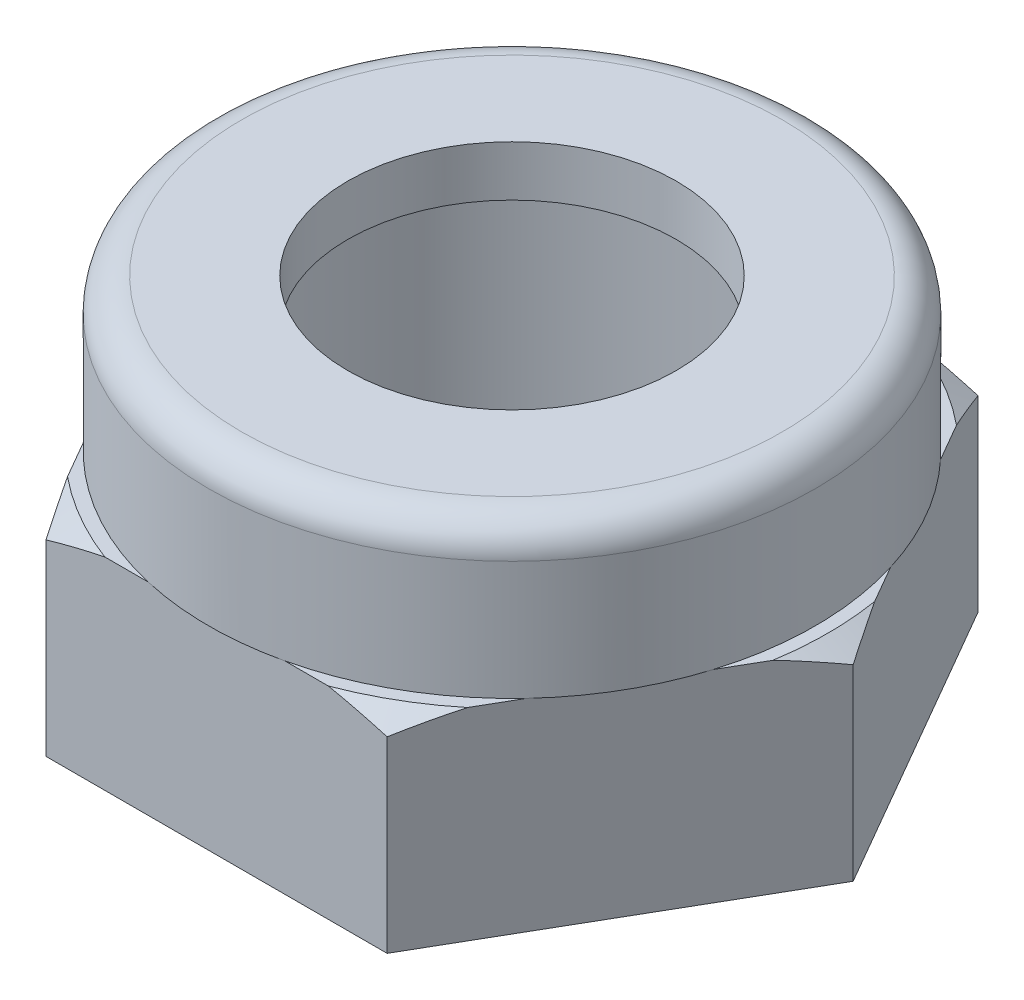
ISO-10303-21;
HEADER;
FILE_DESCRIPTION(('STEP AP214'),'2;1');
FILE_NAME('part.step','',(''),(''),'','','');
FILE_SCHEMA(('AUTOMOTIVE_DESIGN { 1 0 10303 214 1 1 1 1 }'));
ENDSEC;
DATA;
#1=APPLICATION_CONTEXT('core data for automotive mechanical design processes');
#2=APPLICATION_PROTOCOL_DEFINITION('international standard','automotive_design',2000,#1);
#3=PRODUCT_CONTEXT('',#1,'mechanical');
#4=PRODUCT('Part','Part','',(#3));
#5=PRODUCT_RELATED_PRODUCT_CATEGORY('part','',(#4));
#6=PRODUCT_DEFINITION_FORMATION('','',#4);
#7=PRODUCT_DEFINITION_CONTEXT('part definition',#1,'design');
#8=PRODUCT_DEFINITION('design','',#6,#7);
#9=PRODUCT_DEFINITION_SHAPE('','',#8);
#10=(LENGTH_UNIT() NAMED_UNIT(*) SI_UNIT(.MILLI.,.METRE.));
#11=(NAMED_UNIT(*) PLANE_ANGLE_UNIT() SI_UNIT($,.RADIAN.));
#12=(NAMED_UNIT(*) SI_UNIT($,.STERADIAN.) SOLID_ANGLE_UNIT());
#13=UNCERTAINTY_MEASURE_WITH_UNIT(LENGTH_MEASURE(1.E-05),#10,'distance_accuracy_value','');
#14=(GEOMETRIC_REPRESENTATION_CONTEXT(3) GLOBAL_UNCERTAINTY_ASSIGNED_CONTEXT((#13)) GLOBAL_UNIT_ASSIGNED_CONTEXT((#10,
#11,#12)) REPRESENTATION_CONTEXT('',''));
#15=CARTESIAN_POINT('',(0.,0.,0.));
#16=DIRECTION('',(0.,0.,1.));
#17=DIRECTION('',(1.,0.,0.));
#18=AXIS2_PLACEMENT_3D('',#15,#16,#17);
#19=CARTESIAN_POINT('',(0.,0.,-13.5));
#20=DIRECTION('',(0.,-1.,0.));
#21=DIRECTION('',(0.,0.,-1.));
#22=AXIS2_PLACEMENT_3D('',#19,#20,#21);
#23=PLANE('',#22);
#24=CARTESIAN_POINT('',(0.,0.,0.));
#25=DIRECTION('',(0.,-1.,0.));
#26=DIRECTION('',(0.,0.,-1.));
#27=AXIS2_PLACEMENT_3D('',#24,#25,#26);
#28=CIRCLE('',#27,11.6);
#29=CARTESIAN_POINT('',(0.,0.,-11.6));
#30=VERTEX_POINT('',#29);
#31=EDGE_CURVE('E12',#30,#30,#28,.F.);
#32=ORIENTED_EDGE('',*,*,#31,.T.);
#33=EDGE_LOOP('',(#32));
#34=FACE_BOUND('',#33,.T.);
#35=DIRECTION('',(-1.,0.,0.));
#36=VECTOR('',#35,1.);
#37=CARTESIAN_POINT('',(6.74999999999989,0.,11.69134295109));
#38=LINE('',#37,#36);
#39=CARTESIAN_POINT('',(6.74999999999989,0.,11.69134295109));
#40=VERTEX_POINT('',#39);
#41=CARTESIAN_POINT('',(-6.75000000000013,0.,11.6913429510898));
#42=VERTEX_POINT('',#41);
#43=EDGE_CURVE('E204',#40,#42,#38,.T.);
#44=ORIENTED_EDGE('',*,*,#43,.T.);
#45=DIRECTION('',(-0.499999999999995,0.,-0.866025403784441));
#46=VECTOR('',#45,1.);
#47=CARTESIAN_POINT('',(-6.75000000000013,0.,11.6913429510898));
#48=LINE('',#47,#46);
#49=CARTESIAN_POINT('',(-13.5,0.,0.));
#50=VERTEX_POINT('',#49);
#51=EDGE_CURVE('E198',#42,#50,#48,.T.);
#52=ORIENTED_EDGE('',*,*,#51,.T.);
#53=DIRECTION('',(0.500000000000001,0.,-0.866025403784438));
#54=VECTOR('',#53,1.);
#55=CARTESIAN_POINT('',(-13.5,0.,0.));
#56=LINE('',#55,#54);
#57=CARTESIAN_POINT('',(-6.74999999999998,0.,-11.6913429510899));
#58=VERTEX_POINT('',#57);
#59=EDGE_CURVE('E194',#50,#58,#56,.T.);
#60=ORIENTED_EDGE('',*,*,#59,.T.);
#61=DIRECTION('',(1.,0.,0.));
#62=VECTOR('',#61,1.);
#63=CARTESIAN_POINT('',(-6.74999999999997,0.,-11.6913429510899));
#64=LINE('',#63,#62);
#65=CARTESIAN_POINT('',(6.75000000000005,0.,-11.6913429510899));
#66=VERTEX_POINT('',#65);
#67=EDGE_CURVE('E61',#58,#66,#64,.T.);
#68=ORIENTED_EDGE('',*,*,#67,.T.);
#69=DIRECTION('',(0.499999999999995,0.,0.866025403784442));
#70=VECTOR('',#69,1.);
#71=CARTESIAN_POINT('',(6.75000000000005,0.,-11.6913429510899));
#72=LINE('',#71,#70);
#73=CARTESIAN_POINT('',(13.5,0.,0.));
#74=VERTEX_POINT('',#73);
#75=EDGE_CURVE('E182',#66,#74,#72,.T.);
#76=ORIENTED_EDGE('',*,*,#75,.T.);
#77=DIRECTION('',(-0.500000000000007,0.,0.866025403784435));
#78=VECTOR('',#77,1.);
#79=CARTESIAN_POINT('',(13.5,0.,0.));
#80=LINE('',#79,#78);
#81=EDGE_CURVE('E189',#74,#40,#80,.T.);
#82=ORIENTED_EDGE('',*,*,#81,.T.);
#83=EDGE_LOOP('',(#44,#52,#60,#68,#76,#82));
#84=FACE_BOUND('',#83,.T.);
#85=ADVANCED_FACE('F44',(#34,#84),#23,.T.);
#86=CARTESIAN_POINT('',(0.,8.,-12.));
#87=DIRECTION('',(0.,1.,0.));
#88=DIRECTION('',(0.,0.,1.));
#89=AXIS2_PLACEMENT_3D('',#86,#87,#88);
#90=PLANE('',#89);
#91=CARTESIAN_POINT('',(0.,8.,0.));
#92=DIRECTION('',(0.,1.,0.));
#93=DIRECTION('',(0.,0.,1.));
#94=AXIS2_PLACEMENT_3D('',#91,#92,#93);
#95=CIRCLE('',#94,12.5);
#96=CARTESIAN_POINT('',(-12.3364757516192,8.,-2.01528311403384));
#97=VERTEX_POINT('',#96);
#98=CARTESIAN_POINT('',(-12.3364757516192,8.,2.01528311403388));
#99=VERTEX_POINT('',#98);
#100=EDGE_CURVE('E451',#97,#99,#95,.T.);
#101=ORIENTED_EDGE('',*,*,#100,.T.);
#102=DIRECTION('',(-0.499999999999995,0.,-0.866025403784441));
#103=VECTOR('',#102,1.);
#104=CARTESIAN_POINT('',(-6.75000000000013,8.,11.6913429510898));
#105=LINE('',#104,#103);
#106=CARTESIAN_POINT('',(-11.477081728299,8.,3.50379722614566));
#107=VERTEX_POINT('',#106);
#108=EDGE_CURVE('E207',#107,#99,#105,.T.);
#109=ORIENTED_EDGE('',*,*,#108,.F.);
#110=CARTESIAN_POINT('',(0.,8.,0.));
#111=DIRECTION('',(0.,-1.,0.));
#112=DIRECTION('',(0.,0.,-1.));
#113=AXIS2_PLACEMENT_3D('',#110,#111,#112);
#114=CIRCLE('',#113,12.);
#115=CARTESIAN_POINT('',(-11.477081728299,8.,-3.50379722614555));
#116=VERTEX_POINT('',#115);
#117=EDGE_CURVE('E427',#107,#116,#114,.T.);
#118=ORIENTED_EDGE('',*,*,#117,.T.);
#119=DIRECTION('',(0.500000000000001,0.,-0.866025403784438));
#120=VECTOR('',#119,1.);
#121=CARTESIAN_POINT('',(-13.5,8.,0.));
#122=LINE('',#121,#120);
#123=EDGE_CURVE('E357',#97,#116,#122,.T.);
#124=ORIENTED_EDGE('',*,*,#123,.F.);
#125=EDGE_LOOP('',(#101,#109,#118,#124));
#126=FACE_BOUND('',#125,.T.);
#127=ADVANCED_FACE('F298',(#126),#90,.T.);
#128=CARTESIAN_POINT('',(-2.70416345659816,8.,11.6913429510899));
#129=VERTEX_POINT('',#128);
#130=CARTESIAN_POINT('',(-8.77291827170116,8.,8.18754572494419));
#131=VERTEX_POINT('',#130);
#132=EDGE_CURVE('E417',#129,#131,#114,.T.);
#133=ORIENTED_EDGE('',*,*,#132,.T.);
#134=CARTESIAN_POINT('',(-7.91352424838089,8.,9.67605983705596));
#135=VERTEX_POINT('',#134);
#136=EDGE_CURVE('E446',#135,#131,#105,.T.);
#137=ORIENTED_EDGE('',*,*,#136,.F.);
#138=CARTESIAN_POINT('',(-4.42295150323865,8.,11.6913429510899));
#139=VERTEX_POINT('',#138);
#140=EDGE_CURVE('E253',#135,#139,#95,.T.);
#141=ORIENTED_EDGE('',*,*,#140,.T.);
#142=DIRECTION('',(-1.,0.,0.));
#143=VECTOR('',#142,1.);
#144=CARTESIAN_POINT('',(6.74999999999989,8.,11.69134295109));
#145=LINE('',#144,#143);
#146=EDGE_CURVE('E391',#129,#139,#145,.T.);
#147=ORIENTED_EDGE('',*,*,#146,.F.);
#148=EDGE_LOOP('',(#133,#137,#141,#147));
#149=FACE_BOUND('',#148,.T.);
#150=ADVANCED_FACE('F301',(#149),#90,.T.);
#151=CARTESIAN_POINT('',(8.7729182717009,8.,8.18754572494447));
#152=VERTEX_POINT('',#151);
#153=CARTESIAN_POINT('',(2.70416345659791,8.,11.6913429510899));
#154=VERTEX_POINT('',#153);
#155=EDGE_CURVE('E414',#152,#154,#114,.T.);
#156=ORIENTED_EDGE('',*,*,#155,.T.);
#157=CARTESIAN_POINT('',(4.4229515032384,8.,11.69134295109));
#158=VERTEX_POINT('',#157);
#159=EDGE_CURVE('E221',#158,#154,#145,.T.);
#160=ORIENTED_EDGE('',*,*,#159,.F.);
#161=CARTESIAN_POINT('',(7.91352424838065,8.,9.67605983705615));
#162=VERTEX_POINT('',#161);
#163=EDGE_CURVE('E254',#158,#162,#95,.T.);
#164=ORIENTED_EDGE('',*,*,#163,.T.);
#165=DIRECTION('',(-0.500000000000007,0.,0.866025403784435));
#166=VECTOR('',#165,1.);
#167=CARTESIAN_POINT('',(13.5,8.,0.));
#168=LINE('',#167,#166);
#169=EDGE_CURVE('E379',#152,#162,#168,.T.);
#170=ORIENTED_EDGE('',*,*,#169,.F.);
#171=EDGE_LOOP('',(#156,#160,#164,#170));
#172=FACE_BOUND('',#171,.T.);
#173=ADVANCED_FACE('F422',(#172),#90,.T.);
#174=CARTESIAN_POINT('',(11.477081728299,8.,-3.50379722614545));
#175=VERTEX_POINT('',#174);
#176=CARTESIAN_POINT('',(11.477081728299,8.,3.50379722614561));
#177=VERTEX_POINT('',#176);
#178=EDGE_CURVE('E232',#175,#177,#114,.T.);
#179=ORIENTED_EDGE('',*,*,#178,.T.);
#180=CARTESIAN_POINT('',(12.3364757516192,8.,2.01528311403392));
#181=VERTEX_POINT('',#180);
#182=EDGE_CURVE('E382',#181,#177,#168,.T.);
#183=ORIENTED_EDGE('',*,*,#182,.F.);
#184=CARTESIAN_POINT('',(12.3364757516193,8.,-2.01528311403375));
#185=VERTEX_POINT('',#184);
#186=EDGE_CURVE('E259',#181,#185,#95,.T.);
#187=ORIENTED_EDGE('',*,*,#186,.T.);
#188=DIRECTION('',(0.499999999999995,0.,0.866025403784442));
#189=VECTOR('',#188,1.);
#190=CARTESIAN_POINT('',(6.75000000000005,8.,-11.6913429510899));
#191=LINE('',#190,#189);
#192=EDGE_CURVE('E369',#175,#185,#191,.T.);
#193=ORIENTED_EDGE('',*,*,#192,.F.);
#194=EDGE_LOOP('',(#179,#183,#187,#193));
#195=FACE_BOUND('',#194,.T.);
#196=ADVANCED_FACE('F530',(#195),#90,.T.);
#197=CARTESIAN_POINT('',(2.70416345659807,8.,-11.6913429510899));
#198=VERTEX_POINT('',#197);
#199=CARTESIAN_POINT('',(8.77291827170102,8.,-8.18754572494434));
#200=VERTEX_POINT('',#199);
#201=EDGE_CURVE('E227',#198,#200,#114,.T.);
#202=ORIENTED_EDGE('',*,*,#201,.T.);
#203=CARTESIAN_POINT('',(7.91352424838078,8.,-9.67605983705604));
#204=VERTEX_POINT('',#203);
#205=EDGE_CURVE('E350',#204,#200,#191,.T.);
#206=ORIENTED_EDGE('',*,*,#205,.F.);
#207=CARTESIAN_POINT('',(4.42295150323856,8.,-11.6913429510899));
#208=VERTEX_POINT('',#207);
#209=EDGE_CURVE('E353',#204,#208,#95,.T.);
#210=ORIENTED_EDGE('',*,*,#209,.T.);
#211=DIRECTION('',(1.,0.,0.));
#212=VECTOR('',#211,1.);
#213=CARTESIAN_POINT('',(-6.74999999999997,8.,-11.6913429510899));
#214=LINE('',#213,#212);
#215=EDGE_CURVE('E352',#198,#208,#214,.T.);
#216=ORIENTED_EDGE('',*,*,#215,.F.);
#217=EDGE_LOOP('',(#202,#206,#210,#216));
#218=FACE_BOUND('',#217,.T.);
#219=ADVANCED_FACE('F347',(#218),#90,.T.);
#220=CARTESIAN_POINT('',(-8.77291827170097,8.,-8.18754572494439));
#221=VERTEX_POINT('',#220);
#222=CARTESIAN_POINT('',(-2.704163456598,8.,-11.6913429510899));
#223=VERTEX_POINT('',#222);
#224=EDGE_CURVE('E233',#221,#223,#114,.T.);
#225=ORIENTED_EDGE('',*,*,#224,.T.);
#226=CARTESIAN_POINT('',(-4.42295150323848,8.,-11.6913429510899));
#227=VERTEX_POINT('',#226);
#228=EDGE_CURVE('E359',#227,#223,#214,.T.);
#229=ORIENTED_EDGE('',*,*,#228,.F.);
#230=CARTESIAN_POINT('',(-7.91352424838072,8.,-9.6760598370561));
#231=VERTEX_POINT('',#230);
#232=EDGE_CURVE('E460',#227,#231,#95,.T.);
#233=ORIENTED_EDGE('',*,*,#232,.T.);
#234=EDGE_CURVE('E365',#221,#231,#122,.T.);
#235=ORIENTED_EDGE('',*,*,#234,.F.);
#236=EDGE_LOOP('',(#225,#229,#233,#235));
#237=FACE_BOUND('',#236,.T.);
#238=ADVANCED_FACE('F303',(#237),#90,.T.);
#239=CARTESIAN_POINT('',(0.,7.42264973081037,0.));
#240=DIRECTION('',(0.,-1.,0.));
#241=DIRECTION('',(0.,0.,-1.));
#242=AXIS2_PLACEMENT_3D('',#239,#240,#241);
#243=CONICAL_SURFACE('',#242,13.5,1.0471975511966);
#244=ORIENTED_EDGE('',*,*,#140,.F.);
#245=CARTESIAN_POINT('',(-13.5004041451884,7.42241638699952,-0.0007));
#246=CARTESIAN_POINT('',(-13.3520221794924,7.50807589105226,0.256305103512444));
#247=CARTESIAN_POINT('',(-13.2030869667463,7.58984802603486,0.514268459024735));
#248=CARTESIAN_POINT('',(-12.9040221630351,7.74453885758792,1.03226389380826));
#249=CARTESIAN_POINT('',(-12.7538921964382,7.81745464225572,1.29229662369274));
#250=CARTESIAN_POINT('',(-12.3010830182735,8.02150655548143,2.07658512640738));
#251=CARTESIAN_POINT('',(-11.996616201088,8.13757287342653,2.6039371229915));
#252=CARTESIAN_POINT('',(-11.5409955163696,8.27367603116612,3.39309529790317));
#253=CARTESIAN_POINT('',(-11.3912030140215,8.31244761215666,3.652543522563));
#254=CARTESIAN_POINT('',(-11.0909243203889,8.37746722686058,4.17264147636505));
#255=CARTESIAN_POINT('',(-10.9404381158136,8.40371501961168,4.43329122852768));
#256=CARTESIAN_POINT('',(-10.6392146913374,8.44301473352314,4.9550255041503));
#257=CARTESIAN_POINT('',(-10.4884779840743,8.45608233840359,5.21610913969564));
#258=CARTESIAN_POINT('',(-10.1868647374805,8.46874320092821,5.73851860703194));
#259=CARTESIAN_POINT('',(-10.0359882026117,8.4683368746631,5.99984443109464));
#260=CARTESIAN_POINT('',(-9.75390524547986,8.4549882673845,6.48842644479622));
#261=CARTESIAN_POINT('',(-9.62267874384666,8.44367422607495,6.71571741292446));
#262=CARTESIAN_POINT('',(-9.36052753349487,8.41106602795221,7.16977662851943));
#263=CARTESIAN_POINT('',(-9.22960284679319,8.38977116484764,7.39654483785179));
#264=CARTESIAN_POINT('',(-8.96812643014912,8.33757270541938,7.84943527646037));
#265=CARTESIAN_POINT('',(-8.83757509871046,8.30666116870838,8.07555681550789));
#266=CARTESIAN_POINT('',(-8.57708457978593,8.23577190260181,8.52673962917517));
#267=CARTESIAN_POINT('',(-8.44714543453592,8.19579355675579,8.75180083064027));
#268=CARTESIAN_POINT('',(-8.05270676947056,8.06124753513704,9.43498863900312));
#269=CARTESIAN_POINT('',(-7.78934970799097,7.9532620438052,9.89113645001782));
#270=CARTESIAN_POINT('',(-7.26656345425055,7.70817650317858,10.7966288029948));
#271=CARTESIAN_POINT('',(-7.00712756413563,7.57113404492589,11.2459849459807));
#272=CARTESIAN_POINT('',(-6.7495958548117,7.42241638699952,11.6920429510898));
#273=B_SPLINE_CURVE_WITH_KNOTS('',3,(#245,#246,#247,#248,#249,#250,#251,#252,#253,#254,#255,
#256,#257,#258,#259,#260,#261,#262,#263,#264,#265,#266,#267,#268,#269,#270,#271,#272),
.UNSPECIFIED.,.F.,.F.,(4,2,2,2,2,2,2,2,2,2,2,2,2,4),(0.,0.926563632411528,1.85343109213171,
3.71111260515696,4.61715212150051,5.52320906967365,6.42818658190973,7.33313614740977,
8.12103653288097,8.90899268242645,9.69760117370425,10.486263298389,12.0982779379972,
13.7071269345817),.UNSPECIFIED.);
#274=CARTESIAN_POINT('',(-6.75000000000013,7.42264973081037,11.6913429510898));
#275=VERTEX_POINT('',#274);
#276=EDGE_CURVE('E471',#135,#275,#273,.T.);
#277=ORIENTED_EDGE('',*,*,#276,.T.);
#278=CARTESIAN_POINT('',(-6.75070000000013,7.42244765035798,11.6913429510898));
#279=CARTESIAN_POINT('',(-6.45393698052101,7.50810586096598,11.6913429510898));
#280=CARTESIAN_POINT('',(-6.15606747141357,7.58987667122378,11.6913429510898));
#281=CARTESIAN_POINT('',(-5.55793971559512,7.74456479596085,11.6913429510899));
#282=CARTESIAN_POINT('',(-5.25768071762788,7.81747919852352,11.6913429510899));
#283=CARTESIAN_POINT('',(-4.35206527410896,8.02152686878093,11.6913429510899));
#284=CARTESIAN_POINT('',(-3.74313366026425,8.13759025266538,11.6913429510899));
#285=CARTESIAN_POINT('',(-2.83189533463,8.27368903846372,11.6913429510899));
#286=CARTESIAN_POINT('',(-2.53231127204581,8.31245918954676,11.6913429510899));
#287=CARTESIAN_POINT('',(-1.93175582523191,8.37747595796385,11.6913429510899));
#288=CARTESIAN_POINT('',(-1.63078441441983,8.40372233431978,11.6913429510899));
#289=CARTESIAN_POINT('',(-1.02833961089227,8.44301926551599,11.6913429510899));
#290=CARTESIAN_POINT('',(-0.726867243345393,8.45608550350752,11.6913429510899));
#291=CARTESIAN_POINT('',(-0.123642905026414,8.46874371500357,11.6913429510899));
#292=CARTESIAN_POINT('',(0.178109056822752,8.46833610464009,11.6913429510899));
#293=CARTESIAN_POINT('',(0.742265820336324,8.4549853707747,11.6913429510899));
#294=CARTESIAN_POINT('',(1.00471079416508,8.44367074585779,11.6913429510899));
#295=CARTESIAN_POINT('',(1.5289971644472,8.41106201282665,11.6913429510899));
#296=CARTESIAN_POINT('',(1.79083851687153,8.38976719852997,11.6913429510899));
#297=CARTESIAN_POINT('',(2.31377532562189,8.33756944503508,11.6913429510899));
#298=CARTESIAN_POINT('',(2.57486998505327,8.306658566707,11.6913429510899));
#299=CARTESIAN_POINT('',(3.09583508665537,8.23577118052246,11.6913429510899));
#300=CARTESIAN_POINT('',(3.35570544436492,8.19579405629512,11.6913429510899));
#301=CARTESIAN_POINT('',(4.14455828646923,8.06125260425644,11.69134295109));
#302=CARTESIAN_POINT('',(4.67125600464197,7.95327129585099,11.69134295109));
#303=CARTESIAN_POINT('',(5.71679625919071,7.70819571065819,11.69134295109));
#304=CARTESIAN_POINT('',(6.2356521893125,7.57115901701527,11.69134295109));
#305=CARTESIAN_POINT('',(6.75069999999989,7.42244765035798,11.69134295109));
#306=B_SPLINE_CURVE_WITH_KNOTS('',3,(#278,#279,#280,#281,#282,#283,#284,#285,#286,#287,#288,
#289,#290,#291,#292,#293,#294,#295,#296,#297,#298,#299,#300,#301,#302,#303,#304,#305),
.UNSPECIFIED.,.F.,.F.,(4,2,2,2,2,2,2,2,2,2,2,2,2,4),(0.,0.92655992728907,1.85342368018105,
3.71109757512918,4.61713373776867,5.52318733333754,6.42816153223016,7.33310778154525,
8.12098419570767,8.90891636718086,9.69750079848619,10.4861388579711,12.0981028490782,
13.7069015563939),.UNSPECIFIED.);
#307=EDGE_CURVE('E472',#275,#139,#306,.T.);
#308=ORIENTED_EDGE('',*,*,#307,.T.);
#309=EDGE_LOOP('',(#244,#277,#308));
#310=FACE_BOUND('',#309,.T.);
#311=ADVANCED_FACE('F277',(#310),#243,.T.);
#312=ORIENTED_EDGE('',*,*,#163,.F.);
#313=CARTESIAN_POINT('',(6.74999999999989,7.42264973081037,11.69134295109));
#314=VERTEX_POINT('',#313);
#315=EDGE_CURVE('E407',#158,#314,#306,.T.);
#316=ORIENTED_EDGE('',*,*,#315,.T.);
#317=CARTESIAN_POINT('',(6.74959585481146,7.42241638699952,11.69204295109));
#318=CARTESIAN_POINT('',(6.89797782050748,7.50807589105226,11.4350378475775));
#319=CARTESIAN_POINT('',(7.04691303325356,7.58984802603486,11.1770744920653));
#320=CARTESIAN_POINT('',(7.34597783696482,7.74453885758792,10.6590790572817));
#321=CARTESIAN_POINT('',(7.49610780356174,7.81745464225572,10.3990463273973));
#322=CARTESIAN_POINT('',(7.94891698172637,8.02150655548144,9.61475782468262));
#323=CARTESIAN_POINT('',(8.25338379891191,8.13757287342655,9.0874058280985));
#324=CARTESIAN_POINT('',(8.70900448363036,8.27367603116613,8.29824765318684));
#325=CARTESIAN_POINT('',(8.85879698597848,8.31244761215668,8.03879942852701));
#326=CARTESIAN_POINT('',(9.15907567961107,8.3774672268606,7.51870147472497));
#327=CARTESIAN_POINT('',(9.30956188418638,8.4037150196117,7.25805172256234));
#328=CARTESIAN_POINT('',(9.61078530866256,8.44301473352316,6.73631744693972));
#329=CARTESIAN_POINT('',(9.76152201592566,8.45608233840361,6.47523381139439));
#330=CARTESIAN_POINT('',(10.0631352625195,8.46874320092823,5.95282434405809));
#331=CARTESIAN_POINT('',(10.2140117973883,8.46833687466312,5.6914985199954));
#332=CARTESIAN_POINT('',(10.4960947545201,8.45498826738453,5.20291650629381));
#333=CARTESIAN_POINT('',(10.6273212561533,8.44367422607498,4.97562553816557));
#334=CARTESIAN_POINT('',(10.8894724665051,8.41106602795224,4.52156632257059));
#335=CARTESIAN_POINT('',(11.0203971532068,8.38977116484767,4.29479811323823));
#336=CARTESIAN_POINT('',(11.2818735698509,8.33757270541941,3.84190767462964));
#337=CARTESIAN_POINT('',(11.4124249012896,8.30666116870841,3.61578613558212));
#338=CARTESIAN_POINT('',(11.6729154202141,8.23577190260184,3.16460332191482));
#339=CARTESIAN_POINT('',(11.8028545654641,8.19579355675582,2.93954212044972));
#340=CARTESIAN_POINT('',(12.1972932305295,8.06124753513707,2.25635431208685));
#341=CARTESIAN_POINT('',(12.4606502920091,7.95326204380522,1.80020650107215));
#342=CARTESIAN_POINT('',(12.9834365457496,7.70817650317859,0.894714148095122));
#343=CARTESIAN_POINT('',(13.2428724358645,7.57113404492589,0.445358005109218));
#344=CARTESIAN_POINT('',(13.5004041451884,7.42241638699952,-0.000699999999906266));
#345=B_SPLINE_CURVE_WITH_KNOTS('',3,(#317,#318,#319,#320,#321,#322,#323,#324,#325,#326,#327,
#328,#329,#330,#331,#332,#333,#334,#335,#336,#337,#338,#339,#340,#341,#342,#343,#344),
.UNSPECIFIED.,.F.,.F.,(4,2,2,2,2,2,2,2,2,2,2,2,2,4),(0.,0.926563632411527,1.85343109213171,
3.71111260515696,4.61715212150051,5.52320906967365,6.42818658190973,7.33313614740977,
8.12103653288099,8.9089926824265,9.69760117370431,10.4862632983891,12.0982779379973,
13.7071269345819),.UNSPECIFIED.);
#346=EDGE_CURVE('E478',#314,#162,#345,.T.);
#347=ORIENTED_EDGE('',*,*,#346,.T.);
#348=EDGE_LOOP('',(#312,#316,#347));
#349=FACE_BOUND('',#348,.T.);
#350=ADVANCED_FACE('F520',(#349),#243,.T.);
#351=ORIENTED_EDGE('',*,*,#186,.F.);
#352=CARTESIAN_POINT('',(13.5,7.42264973081037,0.));
#353=VERTEX_POINT('',#352);
#354=EDGE_CURVE('E485',#181,#353,#345,.T.);
#355=ORIENTED_EDGE('',*,*,#354,.T.);
#356=CARTESIAN_POINT('',(13.5004041451884,7.42241638699952,0.00070000000009427));
#357=CARTESIAN_POINT('',(13.3520221794924,7.50807589105226,-0.256305103512349));
#358=CARTESIAN_POINT('',(13.2030869667463,7.58984802603486,-0.514268459024639));
#359=CARTESIAN_POINT('',(12.9040221630351,7.74453885758792,-1.03226389380816));
#360=CARTESIAN_POINT('',(12.7538921964382,7.81745464225572,-1.29229662369265));
#361=CARTESIAN_POINT('',(12.3010830182735,8.02150655548144,-2.07658512640729));
#362=CARTESIAN_POINT('',(11.996616201088,8.13757287342655,-2.60393712299141));
#363=CARTESIAN_POINT('',(11.5409955163696,8.27367603116614,-3.39309529790307));
#364=CARTESIAN_POINT('',(11.3912030140215,8.31244761215668,-3.6525435225629));
#365=CARTESIAN_POINT('',(11.0909243203889,8.3774672268606,-4.17264147636495));
#366=CARTESIAN_POINT('',(10.9404381158136,8.4037150196117,-4.43329122852758));
#367=CARTESIAN_POINT('',(10.6392146913374,8.44301473352316,-4.95502550415021));
#368=CARTESIAN_POINT('',(10.4884779840743,8.45608233840361,-5.21610913969554));
#369=CARTESIAN_POINT('',(10.1868647374805,8.46874320092823,-5.73851860703184));
#370=CARTESIAN_POINT('',(10.0359882026117,8.46833687466313,-5.99984443109454));
#371=CARTESIAN_POINT('',(9.75390524547986,8.45498826738453,-6.48842644479613));
#372=CARTESIAN_POINT('',(9.62267874384665,8.44367422607498,-6.71571741292437));
#373=CARTESIAN_POINT('',(9.36052753349486,8.41106602795224,-7.16977662851936));
#374=CARTESIAN_POINT('',(9.22960284679317,8.38977116484767,-7.39654483785172));
#375=CARTESIAN_POINT('',(8.96812643014909,8.33757270541941,-7.84943527646032));
#376=CARTESIAN_POINT('',(8.83757509871044,8.30666116870841,-8.07555681550784));
#377=CARTESIAN_POINT('',(8.57708457978589,8.23577190260184,-8.52673962917514));
#378=CARTESIAN_POINT('',(8.44714543453588,8.19579355675582,-8.75180083064024));
#379=CARTESIAN_POINT('',(8.05270676947051,8.06124753513707,-9.43498863900311));
#380=CARTESIAN_POINT('',(7.78934970799091,7.95326204380522,-9.89113645001782));
#381=CARTESIAN_POINT('',(7.26656345425048,7.70817650317859,-10.7966288029949));
#382=CARTESIAN_POINT('',(7.00712756413556,7.57113404492589,-11.2459849459808));
#383=CARTESIAN_POINT('',(6.74959585481162,7.42241638699952,-11.6920429510899));
#384=B_SPLINE_CURVE_WITH_KNOTS('',3,(#356,#357,#358,#359,#360,#361,#362,#363,#364,#365,#366,
#367,#368,#369,#370,#371,#372,#373,#374,#375,#376,#377,#378,#379,#380,#381,#382,#383),
.UNSPECIFIED.,.F.,.F.,(4,2,2,2,2,2,2,2,2,2,2,2,2,4),(0.,0.926563632411527,1.85343109213171,
3.71111260515696,4.61715212150051,5.52320906967365,6.42818658190973,7.33313614740977,
8.12103653288099,8.9089926824265,9.69760117370431,10.4862632983891,12.0982779379973,
13.7071269345819),.UNSPECIFIED.);
#385=EDGE_CURVE('E505',#353,#185,#384,.T.);
#386=ORIENTED_EDGE('',*,*,#385,.T.);
#387=EDGE_LOOP('',(#351,#355,#386));
#388=FACE_BOUND('',#387,.T.);
#389=ADVANCED_FACE('F528',(#388),#243,.T.);
#390=ORIENTED_EDGE('',*,*,#209,.F.);
#391=CARTESIAN_POINT('',(6.75000000000005,7.42264973081037,-11.6913429510899));
#392=VERTEX_POINT('',#391);
#393=EDGE_CURVE('E499',#204,#392,#384,.T.);
#394=ORIENTED_EDGE('',*,*,#393,.T.);
#395=CARTESIAN_POINT('',(6.75070000000005,7.42244765035798,-11.6913429510899));
#396=CARTESIAN_POINT('',(6.45393698052093,7.50810586096598,-11.6913429510899));
#397=CARTESIAN_POINT('',(6.15606747141349,7.58987667122377,-11.6913429510899));
#398=CARTESIAN_POINT('',(5.55793971559503,7.74456479596085,-11.6913429510899));
#399=CARTESIAN_POINT('',(5.25768071762779,7.81747919852352,-11.6913429510899));
#400=CARTESIAN_POINT('',(4.35206527410888,8.02152686878093,-11.6913429510899));
#401=CARTESIAN_POINT('',(3.74313366026417,8.13759025266538,-11.6913429510899));
#402=CARTESIAN_POINT('',(2.83189533462992,8.27368903846372,-11.6913429510899));
#403=CARTESIAN_POINT('',(2.53231127204573,8.31245918954676,-11.6913429510899));
#404=CARTESIAN_POINT('',(1.93175582523183,8.37747595796385,-11.6913429510899));
#405=CARTESIAN_POINT('',(1.63078441441974,8.40372233431978,-11.6913429510899));
#406=CARTESIAN_POINT('',(1.02833961089219,8.44301926551599,-11.6913429510899));
#407=CARTESIAN_POINT('',(0.726867243345309,8.45608550350752,-11.6913429510899));
#408=CARTESIAN_POINT('',(0.12364290502633,8.46874371500357,-11.6913429510899));
#409=CARTESIAN_POINT('',(-0.178109056822836,8.46833610464009,-11.6913429510899));
#410=CARTESIAN_POINT('',(-0.742265820336409,8.4549853707747,-11.6913429510899));
#411=CARTESIAN_POINT('',(-1.00471079416517,8.44367074585778,-11.6913429510899));
#412=CARTESIAN_POINT('',(-1.52899716444728,8.41106201282664,-11.6913429510899));
#413=CARTESIAN_POINT('',(-1.79083851687161,8.38976719852997,-11.6913429510899));
#414=CARTESIAN_POINT('',(-2.31377532562198,8.33756944503507,-11.6913429510899));
#415=CARTESIAN_POINT('',(-2.57486998505336,8.306658566707,-11.6913429510899));
#416=CARTESIAN_POINT('',(-3.09583508665545,8.23577118052246,-11.6913429510899));
#417=CARTESIAN_POINT('',(-3.35570544436501,8.19579405629512,-11.6913429510899));
#418=CARTESIAN_POINT('',(-4.14455828646931,8.06125260425644,-11.6913429510899));
#419=CARTESIAN_POINT('',(-4.67125600464205,7.95327129585099,-11.6913429510899));
#420=CARTESIAN_POINT('',(-5.71679625919079,7.70819571065819,-11.6913429510899));
#421=CARTESIAN_POINT('',(-6.23565218931258,7.57115901701527,-11.6913429510899));
#422=CARTESIAN_POINT('',(-6.75069999999997,7.42244765035798,-11.6913429510899));
#423=B_SPLINE_CURVE_WITH_KNOTS('',3,(#395,#396,#397,#398,#399,#400,#401,#402,#403,#404,#405,
#406,#407,#408,#409,#410,#411,#412,#413,#414,#415,#416,#417,#418,#419,#420,#421,#422),
.UNSPECIFIED.,.F.,.F.,(4,2,2,2,2,2,2,2,2,2,2,2,2,4),(0.,0.926559927289071,1.85342368018105,
3.71109757512918,4.61713373776867,5.52318733333754,6.42816153223016,7.33310778154525,
8.12098419570767,8.90891636718086,9.69750079848619,10.4861388579711,12.0981028490782,
13.7069015563939),.UNSPECIFIED.);
#424=EDGE_CURVE('E174',#392,#208,#423,.T.);
#425=ORIENTED_EDGE('',*,*,#424,.T.);
#426=EDGE_LOOP('',(#390,#394,#425));
#427=FACE_BOUND('',#426,.T.);
#428=ADVANCED_FACE('F578',(#427),#243,.T.);
#429=ORIENTED_EDGE('',*,*,#232,.F.);
#430=CARTESIAN_POINT('',(-6.74999999999997,7.42264973081037,-11.6913429510899));
#431=VERTEX_POINT('',#430);
#432=EDGE_CURVE('E506',#227,#431,#423,.T.);
#433=ORIENTED_EDGE('',*,*,#432,.T.);
#434=CARTESIAN_POINT('',(-6.74959585481154,7.42241638699952,-11.6920429510899));
#435=CARTESIAN_POINT('',(-6.89797782050756,7.50807589105226,-11.4350378475775));
#436=CARTESIAN_POINT('',(-7.04691303325364,7.58984802603486,-11.1770744920652));
#437=CARTESIAN_POINT('',(-7.3459778369649,7.74453885758792,-10.6590790572817));
#438=CARTESIAN_POINT('',(-7.49610780356182,7.81745464225572,-10.3990463273972));
#439=CARTESIAN_POINT('',(-7.94891698172644,8.02150655548144,-9.61475782468256));
#440=CARTESIAN_POINT('',(-8.25338379891197,8.13757287342655,-9.08740582809845));
#441=CARTESIAN_POINT('',(-8.70900448363042,8.27367603116613,-8.29824765318678));
#442=CARTESIAN_POINT('',(-8.85879698597854,8.31244761215668,-8.03879942852695));
#443=CARTESIAN_POINT('',(-9.15907567961112,8.3774672268606,-7.51870147472491));
#444=CARTESIAN_POINT('',(-9.30956188418643,8.4037150196117,-7.25805172256227));
#445=CARTESIAN_POINT('',(-9.6107853086626,8.44301473352316,-6.73631744693965));
#446=CARTESIAN_POINT('',(-9.76152201592571,8.45608233840361,-6.47523381139432));
#447=CARTESIAN_POINT('',(-10.0631352625195,8.46874320092823,-5.95282434405802));
#448=CARTESIAN_POINT('',(-10.2140117973883,8.46833687466312,-5.69149851999533));
#449=CARTESIAN_POINT('',(-10.4960947545202,8.45498826738453,-5.20291650629374));
#450=CARTESIAN_POINT('',(-10.6273212561534,8.44367422607498,-4.9756255381655));
#451=CARTESIAN_POINT('',(-10.8894724665052,8.41106602795224,-4.52156632257051));
#452=CARTESIAN_POINT('',(-11.0203971532068,8.38977116484767,-4.29479811323815));
#453=CARTESIAN_POINT('',(-11.2818735698509,8.33757270541941,-3.84190767462956));
#454=CARTESIAN_POINT('',(-11.4124249012896,8.30666116870841,-3.61578613558204));
#455=CARTESIAN_POINT('',(-11.6729154202141,8.23577190260184,-3.16460332191474));
#456=CARTESIAN_POINT('',(-11.8028545654641,8.19579355675582,-2.93954212044964));
#457=CARTESIAN_POINT('',(-12.1972932305295,8.06124753513706,-2.25635431208677));
#458=CARTESIAN_POINT('',(-12.4606502920091,7.95326204380522,-1.80020650107206));
#459=CARTESIAN_POINT('',(-12.9834365457496,7.70817650317859,-0.894714148095029));
#460=CARTESIAN_POINT('',(-13.2428724358645,7.5711340449259,-0.445358005109123));
#461=CARTESIAN_POINT('',(-13.5004041451884,7.42241638699952,0.000700000000000197));
#462=B_SPLINE_CURVE_WITH_KNOTS('',3,(#434,#435,#436,#437,#438,#439,#440,#441,#442,#443,#444,
#445,#446,#447,#448,#449,#450,#451,#452,#453,#454,#455,#456,#457,#458,#459,#460,#461),
.UNSPECIFIED.,.F.,.F.,(4,2,2,2,2,2,2,2,2,2,2,2,2,4),(0.,0.926563632411528,1.85343109213171,
3.71111260515696,4.61715212150051,5.52320906967365,6.42818658190973,7.33313614740977,
8.12103653288099,8.9089926824265,9.69760117370431,10.4862632983891,12.0982779379973,
13.7071269345819),.UNSPECIFIED.);
#463=EDGE_CURVE('E269',#431,#231,#462,.T.);
#464=ORIENTED_EDGE('',*,*,#463,.T.);
#465=EDGE_LOOP('',(#429,#433,#464));
#466=FACE_BOUND('',#465,.T.);
#467=ADVANCED_FACE('F570',(#466),#243,.T.);
#468=CARTESIAN_POINT('',(-13.5,7.42264973081037,0.));
#469=VERTEX_POINT('',#468);
#470=EDGE_CURVE('E258',#97,#469,#462,.T.);
#471=ORIENTED_EDGE('',*,*,#470,.T.);
#472=EDGE_CURVE('E268',#469,#99,#273,.T.);
#473=ORIENTED_EDGE('',*,*,#472,.T.);
#474=ORIENTED_EDGE('',*,*,#100,.F.);
#475=EDGE_LOOP('',(#471,#473,#474));
#476=FACE_BOUND('',#475,.T.);
#477=ADVANCED_FACE('F324',(#476),#243,.T.);
#478=CARTESIAN_POINT('',(0.,0.,0.));
#479=DIRECTION('',(0.,-1.,0.));
#480=DIRECTION('',(0.,0.,-1.));
#481=AXIS2_PLACEMENT_3D('',#478,#479,#480);
#482=CYLINDRICAL_SURFACE('',#481,10.);
#483=CARTESIAN_POINT('',(0.,1.6,0.));
#484=DIRECTION('',(0.,-1.,0.));
#485=DIRECTION('',(0.,0.,-1.));
#486=AXIS2_PLACEMENT_3D('',#483,#484,#485);
#487=CIRCLE('',#486,10.);
#488=CARTESIAN_POINT('',(0.,1.6,-10.));
#489=VERTEX_POINT('',#488);
#490=EDGE_CURVE('E54',#489,#489,#487,.T.);
#491=ORIENTED_EDGE('',*,*,#490,.T.);
#492=EDGE_LOOP('',(#491));
#493=FACE_BOUND('',#492,.T.);
#494=CARTESIAN_POINT('',(0.,12.,0.));
#495=DIRECTION('',(0.,-1.,0.));
#496=DIRECTION('',(0.,0.,-1.));
#497=AXIS2_PLACEMENT_3D('',#494,#495,#496);
#498=CIRCLE('',#497,10.);
#499=CARTESIAN_POINT('',(0.,12.,-10.));
#500=VERTEX_POINT('',#499);
#501=EDGE_CURVE('E241',#500,#500,#498,.T.);
#502=ORIENTED_EDGE('',*,*,#501,.F.);
#503=EDGE_LOOP('',(#502));
#504=FACE_BOUND('',#503,.T.);
#505=ADVANCED_FACE('F320',(#493,#504),#482,.F.);
#506=CARTESIAN_POINT('',(0.,12.,-10.));
#507=DIRECTION('',(0.,-1.,0.));
#508=DIRECTION('',(0.,0.,-1.));
#509=AXIS2_PLACEMENT_3D('',#506,#507,#508);
#510=PLANE('',#509);
#511=ORIENTED_EDGE('',*,*,#501,.T.);
#512=EDGE_LOOP('',(#511));
#513=FACE_BOUND('',#512,.T.);
#514=CARTESIAN_POINT('',(0.,12.,0.));
#515=DIRECTION('',(0.,-1.,0.));
#516=DIRECTION('',(0.,0.,-1.));
#517=AXIS2_PLACEMENT_3D('',#514,#515,#516);
#518=CIRCLE('',#517,6.5);
#519=CARTESIAN_POINT('',(0.,12.,-6.5));
#520=VERTEX_POINT('',#519);
#521=EDGE_CURVE('E237',#520,#520,#518,.T.);
#522=ORIENTED_EDGE('',*,*,#521,.F.);
#523=EDGE_LOOP('',(#522));
#524=FACE_BOUND('',#523,.T.);
#525=ADVANCED_FACE('F316',(#513,#524),#510,.T.);
#526=CARTESIAN_POINT('',(0.,0.,0.));
#527=DIRECTION('',(0.,-1.,0.));
#528=DIRECTION('',(0.,0.,-1.));
#529=AXIS2_PLACEMENT_3D('',#526,#527,#528);
#530=CYLINDRICAL_SURFACE('',#529,6.5);
#531=ORIENTED_EDGE('',*,*,#521,.T.);
#532=EDGE_LOOP('',(#531));
#533=FACE_BOUND('',#532,.T.);
#534=CARTESIAN_POINT('',(0.,14.,0.));
#535=DIRECTION('',(0.,-1.,0.));
#536=DIRECTION('',(0.,0.,-1.));
#537=AXIS2_PLACEMENT_3D('',#534,#535,#536);
#538=CIRCLE('',#537,6.5);
#539=CARTESIAN_POINT('',(0.,14.,-6.5));
#540=VERTEX_POINT('',#539);
#541=EDGE_CURVE('E231',#540,#540,#538,.T.);
#542=ORIENTED_EDGE('',*,*,#541,.F.);
#543=EDGE_LOOP('',(#542));
#544=FACE_BOUND('',#543,.T.);
#545=ADVANCED_FACE('F312',(#533,#544),#530,.F.);
#546=CARTESIAN_POINT('',(0.,14.,-6.5));
#547=DIRECTION('',(0.,1.,0.));
#548=DIRECTION('',(0.,0.,1.));
#549=AXIS2_PLACEMENT_3D('',#546,#547,#548);
#550=PLANE('',#549);
#551=CARTESIAN_POINT('',(0.,14.,0.));
#552=DIRECTION('',(0.,1.,0.));
#553=DIRECTION('',(0.,0.,1.));
#554=AXIS2_PLACEMENT_3D('',#551,#552,#553);
#555=CIRCLE('',#554,10.7);
#556=CARTESIAN_POINT('',(0.,14.,10.7));
#557=VERTEX_POINT('',#556);
#558=EDGE_CURVE('E249',#557,#557,#555,.T.);
#559=ORIENTED_EDGE('',*,*,#558,.T.);
#560=EDGE_LOOP('',(#559));
#561=FACE_BOUND('',#560,.T.);
#562=ORIENTED_EDGE('',*,*,#541,.T.);
#563=EDGE_LOOP('',(#562));
#564=FACE_BOUND('',#563,.T.);
#565=ADVANCED_FACE('F308',(#561,#564),#550,.T.);
#566=CARTESIAN_POINT('',(0.,0.,0.));
#567=DIRECTION('',(0.,-1.,0.));
#568=DIRECTION('',(0.,0.,-1.));
#569=AXIS2_PLACEMENT_3D('',#566,#567,#568);
#570=CYLINDRICAL_SURFACE('',#569,12.);
#571=CARTESIAN_POINT('',(0.,12.7,0.));
#572=DIRECTION('',(0.,1.,0.));
#573=DIRECTION('',(0.,0.,1.));
#574=AXIS2_PLACEMENT_3D('',#571,#572,#573);
#575=CIRCLE('',#574,12.);
#576=CARTESIAN_POINT('',(0.,12.7,12.));
#577=VERTEX_POINT('',#576);
#578=EDGE_CURVE('E245',#577,#577,#575,.F.);
#579=ORIENTED_EDGE('',*,*,#578,.T.);
#580=EDGE_LOOP('',(#579));
#581=FACE_BOUND('',#580,.T.);
#582=ORIENTED_EDGE('',*,*,#201,.F.);
#583=CARTESIAN_POINT('',(0.,8.,0.));
#584=DIRECTION('',(0.,-1.,0.));
#585=DIRECTION('',(0.,0.,-1.));
#586=AXIS2_PLACEMENT_3D('',#583,#584,#585);
#587=CIRCLE('',#586,12.);
#588=EDGE_CURVE('E211',#198,#223,#587,.F.);
#589=ORIENTED_EDGE('',*,*,#588,.T.);
#590=ORIENTED_EDGE('',*,*,#224,.F.);
#591=EDGE_CURVE('E226',#221,#116,#587,.F.);
#592=ORIENTED_EDGE('',*,*,#591,.T.);
#593=ORIENTED_EDGE('',*,*,#117,.F.);
#594=EDGE_CURVE('E420',#107,#131,#587,.F.);
#595=ORIENTED_EDGE('',*,*,#594,.T.);
#596=ORIENTED_EDGE('',*,*,#132,.F.);
#597=EDGE_CURVE('E413',#129,#154,#587,.F.);
#598=ORIENTED_EDGE('',*,*,#597,.T.);
#599=ORIENTED_EDGE('',*,*,#155,.F.);
#600=EDGE_CURVE('E421',#152,#177,#587,.F.);
#601=ORIENTED_EDGE('',*,*,#600,.T.);
#602=ORIENTED_EDGE('',*,*,#178,.F.);
#603=EDGE_CURVE('E225',#175,#200,#587,.F.);
#604=ORIENTED_EDGE('',*,*,#603,.T.);
#605=EDGE_LOOP('',(#582,#589,#590,#592,#593,#595,#596,#598,#599,#601,#602,#604));
#606=FACE_BOUND('',#605,.T.);
#607=ADVANCED_FACE('F304',(#581,#606),#570,.T.);
#608=CARTESIAN_POINT('',(0.,12.7,0.));
#609=DIRECTION('',(0.,1.,0.));
#610=DIRECTION('',(0.,0.,1.));
#611=AXIS2_PLACEMENT_3D('',#608,#609,#610);
#612=TOROIDAL_SURFACE('',#611,10.7,1.3);
#613=ORIENTED_EDGE('',*,*,#558,.F.);
#614=EDGE_LOOP('',(#613));
#615=FACE_BOUND('',#614,.T.);
#616=ORIENTED_EDGE('',*,*,#578,.F.);
#617=EDGE_LOOP('',(#616));
#618=FACE_BOUND('',#617,.T.);
#619=ADVANCED_FACE('F307',(#615,#618),#612,.T.);
#620=CARTESIAN_POINT('',(0.,8.,0.));
#621=DIRECTION('',(0.,-1.,0.));
#622=DIRECTION('',(0.,0.,-1.));
#623=AXIS2_PLACEMENT_3D('',#620,#621,#622);
#624=PLANE('',#623);
#625=EDGE_CURVE('E363',#116,#221,#122,.T.);
#626=ORIENTED_EDGE('',*,*,#625,.F.);
#627=ORIENTED_EDGE('',*,*,#591,.F.);
#628=EDGE_LOOP('',(#626,#627));
#629=FACE_BOUND('',#628,.T.);
#630=ADVANCED_FACE('F297',(#629),#624,.T.);
#631=EDGE_CURVE('E443',#131,#107,#105,.T.);
#632=ORIENTED_EDGE('',*,*,#631,.F.);
#633=ORIENTED_EDGE('',*,*,#594,.F.);
#634=EDGE_LOOP('',(#632,#633));
#635=FACE_BOUND('',#634,.T.);
#636=ADVANCED_FACE('F333',(#635),#624,.T.);
#637=EDGE_CURVE('E395',#154,#129,#145,.T.);
#638=ORIENTED_EDGE('',*,*,#637,.F.);
#639=ORIENTED_EDGE('',*,*,#597,.F.);
#640=EDGE_LOOP('',(#638,#639));
#641=FACE_BOUND('',#640,.T.);
#642=ADVANCED_FACE('F537',(#641),#624,.T.);
#643=EDGE_CURVE('E381',#177,#152,#168,.T.);
#644=ORIENTED_EDGE('',*,*,#643,.F.);
#645=ORIENTED_EDGE('',*,*,#600,.F.);
#646=EDGE_LOOP('',(#644,#645));
#647=FACE_BOUND('',#646,.T.);
#648=ADVANCED_FACE('F535',(#647),#624,.T.);
#649=EDGE_CURVE('E372',#200,#175,#191,.T.);
#650=ORIENTED_EDGE('',*,*,#649,.F.);
#651=ORIENTED_EDGE('',*,*,#603,.F.);
#652=EDGE_LOOP('',(#650,#651));
#653=FACE_BOUND('',#652,.T.);
#654=ADVANCED_FACE('F295',(#653),#624,.T.);
#655=EDGE_CURVE('E356',#223,#198,#214,.T.);
#656=ORIENTED_EDGE('',*,*,#655,.F.);
#657=ORIENTED_EDGE('',*,*,#588,.F.);
#658=EDGE_LOOP('',(#656,#657));
#659=FACE_BOUND('',#658,.T.);
#660=ADVANCED_FACE('F291',(#659),#624,.T.);
#661=CARTESIAN_POINT('',(-6.75000000000013,8.,11.6913429510898));
#662=DIRECTION('',(-0.866025403784442,0.,0.499999999999995));
#663=DIRECTION('',(0.499999999999995,0.,0.866025403784442));
#664=AXIS2_PLACEMENT_3D('',#661,#662,#663);
#665=PLANE('',#664);
#666=DIRECTION('',(0.,-1.,0.));
#667=VECTOR('',#666,1.);
#668=CARTESIAN_POINT('',(-13.5,8.,0.));
#669=LINE('',#668,#667);
#670=EDGE_CURVE('E69',#469,#50,#669,.T.);
#671=ORIENTED_EDGE('',*,*,#670,.T.);
#672=ORIENTED_EDGE('',*,*,#51,.F.);
#673=DIRECTION('',(0.,-1.,0.));
#674=VECTOR('',#673,1.);
#675=CARTESIAN_POINT('',(-6.75000000000013,8.,11.6913429510898));
#676=LINE('',#675,#674);
#677=EDGE_CURVE('E208',#275,#42,#676,.T.);
#678=ORIENTED_EDGE('',*,*,#677,.F.);
#679=ORIENTED_EDGE('',*,*,#276,.F.);
#680=ORIENTED_EDGE('',*,*,#136,.T.);
#681=ORIENTED_EDGE('',*,*,#631,.T.);
#682=ORIENTED_EDGE('',*,*,#108,.T.);
#683=ORIENTED_EDGE('',*,*,#472,.F.);
#684=EDGE_LOOP('',(#671,#672,#678,#679,#680,#681,#682,#683));
#685=FACE_BOUND('',#684,.T.);
#686=ADVANCED_FACE('F286',(#685),#665,.T.);
#687=CARTESIAN_POINT('',(6.74999999999989,8.,11.69134295109));
#688=DIRECTION('',(0.,0.,1.));
#689=DIRECTION('',(1.,0.,0.));
#690=AXIS2_PLACEMENT_3D('',#687,#688,#689);
#691=PLANE('',#690);
#692=ORIENTED_EDGE('',*,*,#677,.T.);
#693=ORIENTED_EDGE('',*,*,#43,.F.);
#694=DIRECTION('',(0.,-1.,0.));
#695=VECTOR('',#694,1.);
#696=CARTESIAN_POINT('',(6.74999999999989,8.,11.69134295109));
#697=LINE('',#696,#695);
#698=EDGE_CURVE('E212',#314,#40,#697,.T.);
#699=ORIENTED_EDGE('',*,*,#698,.F.);
#700=ORIENTED_EDGE('',*,*,#315,.F.);
#701=ORIENTED_EDGE('',*,*,#159,.T.);
#702=ORIENTED_EDGE('',*,*,#637,.T.);
#703=ORIENTED_EDGE('',*,*,#146,.T.);
#704=ORIENTED_EDGE('',*,*,#307,.F.);
#705=EDGE_LOOP('',(#692,#693,#699,#700,#701,#702,#703,#704));
#706=FACE_BOUND('',#705,.T.);
#707=ADVANCED_FACE('F290',(#706),#691,.T.);
#708=CARTESIAN_POINT('',(13.5,8.,0.));
#709=DIRECTION('',(0.866025403784435,0.,0.500000000000007));
#710=DIRECTION('',(0.500000000000007,0.,-0.866025403784434));
#711=AXIS2_PLACEMENT_3D('',#708,#709,#710);
#712=PLANE('',#711);
#713=ORIENTED_EDGE('',*,*,#698,.T.);
#714=ORIENTED_EDGE('',*,*,#81,.F.);
#715=DIRECTION('',(0.,-1.,0.));
#716=VECTOR('',#715,1.);
#717=CARTESIAN_POINT('',(13.5,8.,0.));
#718=LINE('',#717,#716);
#719=EDGE_CURVE('E178',#353,#74,#718,.T.);
#720=ORIENTED_EDGE('',*,*,#719,.F.);
#721=ORIENTED_EDGE('',*,*,#354,.F.);
#722=ORIENTED_EDGE('',*,*,#182,.T.);
#723=ORIENTED_EDGE('',*,*,#643,.T.);
#724=ORIENTED_EDGE('',*,*,#169,.T.);
#725=ORIENTED_EDGE('',*,*,#346,.F.);
#726=EDGE_LOOP('',(#713,#714,#720,#721,#722,#723,#724,#725));
#727=FACE_BOUND('',#726,.T.);
#728=ADVANCED_FACE('F494',(#727),#712,.T.);
#729=CARTESIAN_POINT('',(6.75000000000005,8.,-11.6913429510899));
#730=DIRECTION('',(0.866025403784442,0.,-0.499999999999995));
#731=DIRECTION('',(-0.499999999999995,0.,-0.866025403784442));
#732=AXIS2_PLACEMENT_3D('',#729,#730,#731);
#733=PLANE('',#732);
#734=ORIENTED_EDGE('',*,*,#719,.T.);
#735=ORIENTED_EDGE('',*,*,#75,.F.);
#736=DIRECTION('',(0.,-1.,0.));
#737=VECTOR('',#736,1.);
#738=CARTESIAN_POINT('',(6.75000000000005,8.,-11.6913429510899));
#739=LINE('',#738,#737);
#740=EDGE_CURVE('E170',#392,#66,#739,.T.);
#741=ORIENTED_EDGE('',*,*,#740,.F.);
#742=ORIENTED_EDGE('',*,*,#393,.F.);
#743=ORIENTED_EDGE('',*,*,#205,.T.);
#744=ORIENTED_EDGE('',*,*,#649,.T.);
#745=ORIENTED_EDGE('',*,*,#192,.T.);
#746=ORIENTED_EDGE('',*,*,#385,.F.);
#747=EDGE_LOOP('',(#734,#735,#741,#742,#743,#744,#745,#746));
#748=FACE_BOUND('',#747,.T.);
#749=ADVANCED_FACE('F183',(#748),#733,.T.);
#750=CARTESIAN_POINT('',(-6.74999999999997,8.,-11.6913429510899));
#751=DIRECTION('',(0.,0.,-1.));
#752=DIRECTION('',(-1.,0.,0.));
#753=AXIS2_PLACEMENT_3D('',#750,#751,#752);
#754=PLANE('',#753);
#755=ORIENTED_EDGE('',*,*,#740,.T.);
#756=ORIENTED_EDGE('',*,*,#67,.F.);
#757=DIRECTION('',(0.,-1.,0.));
#758=VECTOR('',#757,1.);
#759=CARTESIAN_POINT('',(-6.74999999999997,8.,-11.6913429510899));
#760=LINE('',#759,#758);
#761=EDGE_CURVE('E179',#431,#58,#760,.T.);
#762=ORIENTED_EDGE('',*,*,#761,.F.);
#763=ORIENTED_EDGE('',*,*,#432,.F.);
#764=ORIENTED_EDGE('',*,*,#228,.T.);
#765=ORIENTED_EDGE('',*,*,#655,.T.);
#766=ORIENTED_EDGE('',*,*,#215,.T.);
#767=ORIENTED_EDGE('',*,*,#424,.F.);
#768=EDGE_LOOP('',(#755,#756,#762,#763,#764,#765,#766,#767));
#769=FACE_BOUND('',#768,.T.);
#770=ADVANCED_FACE('F172',(#769),#754,.T.);
#771=CARTESIAN_POINT('',(-13.5,8.,0.));
#772=DIRECTION('',(-0.866025403784438,0.,-0.500000000000001));
#773=DIRECTION('',(-0.500000000000001,0.,0.866025403784438));
#774=AXIS2_PLACEMENT_3D('',#771,#772,#773);
#775=PLANE('',#774);
#776=ORIENTED_EDGE('',*,*,#761,.T.);
#777=ORIENTED_EDGE('',*,*,#59,.F.);
#778=ORIENTED_EDGE('',*,*,#670,.F.);
#779=ORIENTED_EDGE('',*,*,#470,.F.);
#780=ORIENTED_EDGE('',*,*,#123,.T.);
#781=ORIENTED_EDGE('',*,*,#625,.T.);
#782=ORIENTED_EDGE('',*,*,#234,.T.);
#783=ORIENTED_EDGE('',*,*,#463,.F.);
#784=EDGE_LOOP('',(#776,#777,#778,#779,#780,#781,#782,#783));
#785=FACE_BOUND('',#784,.T.);
#786=ADVANCED_FACE('F280',(#785),#775,.T.);
#787=CARTESIAN_POINT('',(0.,1.6,0.));
#788=DIRECTION('',(0.,-1.,0.));
#789=DIRECTION('',(0.,0.,-1.));
#790=AXIS2_PLACEMENT_3D('',#787,#788,#789);
#791=CONICAL_SURFACE('',#790,10.,0.785398163397452);
#792=CARTESIAN_POINT('',(0.,0.,-11.6));
#793=CARTESIAN_POINT('',(0.,0.0166666666666667,-11.5833333333333));
#794=CARTESIAN_POINT('',(0.,0.0333333333333334,-11.5666666666667));
#795=CARTESIAN_POINT('',(0.,0.0666666666666669,-11.5333333333333));
#796=CARTESIAN_POINT('',(0.,0.0833333333333336,-11.5166666666667));
#797=CARTESIAN_POINT('',(0.,0.116666666666667,-11.4833333333333));
#798=CARTESIAN_POINT('',(0.,0.133333333333333,-11.4666666666667));
#799=CARTESIAN_POINT('',(0.,0.166666666666667,-11.4333333333333));
#800=CARTESIAN_POINT('',(0.,0.183333333333334,-11.4166666666667));
#801=CARTESIAN_POINT('',(0.,0.216666666666667,-11.3833333333333));
#802=CARTESIAN_POINT('',(0.,0.233333333333333,-11.3666666666667));
#803=CARTESIAN_POINT('',(0.,0.266666666666666,-11.3333333333333));
#804=CARTESIAN_POINT('',(0.,0.283333333333333,-11.3166666666667));
#805=CARTESIAN_POINT('',(0.,0.316666666666667,-11.2833333333333));
#806=CARTESIAN_POINT('',(0.,0.333333333333334,-11.2666666666667));
#807=CARTESIAN_POINT('',(0.,0.366666666666667,-11.2333333333333));
#808=CARTESIAN_POINT('',(0.,0.383333333333333,-11.2166666666667));
#809=CARTESIAN_POINT('',(0.,0.416666666666666,-11.1833333333333));
#810=CARTESIAN_POINT('',(0.,0.433333333333333,-11.1666666666667));
#811=CARTESIAN_POINT('',(0.,0.466666666666667,-11.1333333333333));
#812=CARTESIAN_POINT('',(0.,0.483333333333333,-11.1166666666667));
#813=CARTESIAN_POINT('',(0.,0.516666666666667,-11.0833333333333));
#814=CARTESIAN_POINT('',(0.,0.533333333333333,-11.0666666666667));
#815=CARTESIAN_POINT('',(0.,0.566666666666666,-11.0333333333333));
#816=CARTESIAN_POINT('',(0.,0.583333333333333,-11.0166666666667));
#817=CARTESIAN_POINT('',(0.,0.616666666666666,-10.9833333333333));
#818=CARTESIAN_POINT('',(0.,0.633333333333333,-10.9666666666667));
#819=CARTESIAN_POINT('',(0.,0.666666666666666,-10.9333333333333));
#820=CARTESIAN_POINT('',(0.,0.683333333333333,-10.9166666666667));
#821=CARTESIAN_POINT('',(0.,0.716666666666666,-10.8833333333333));
#822=CARTESIAN_POINT('',(0.,0.733333333333333,-10.8666666666667));
#823=CARTESIAN_POINT('',(0.,0.766666666666666,-10.8333333333333));
#824=CARTESIAN_POINT('',(0.,0.783333333333333,-10.8166666666667));
#825=CARTESIAN_POINT('',(0.,0.816666666666666,-10.7833333333333));
#826=CARTESIAN_POINT('',(0.,0.833333333333333,-10.7666666666667));
#827=CARTESIAN_POINT('',(0.,0.866666666666666,-10.7333333333333));
#828=CARTESIAN_POINT('',(0.,0.883333333333333,-10.7166666666667));
#829=CARTESIAN_POINT('',(0.,0.916666666666666,-10.6833333333333));
#830=CARTESIAN_POINT('',(0.,0.933333333333333,-10.6666666666667));
#831=CARTESIAN_POINT('',(0.,0.966666666666666,-10.6333333333333));
#832=CARTESIAN_POINT('',(0.,0.983333333333333,-10.6166666666667));
#833=CARTESIAN_POINT('',(0.,1.01666666666667,-10.5833333333333));
#834=CARTESIAN_POINT('',(0.,1.03333333333333,-10.5666666666667));
#835=CARTESIAN_POINT('',(0.,1.06666666666667,-10.5333333333333));
#836=CARTESIAN_POINT('',(0.,1.08333333333333,-10.5166666666667));
#837=CARTESIAN_POINT('',(0.,1.11666666666667,-10.4833333333333));
#838=CARTESIAN_POINT('',(0.,1.13333333333333,-10.4666666666667));
#839=CARTESIAN_POINT('',(0.,1.16666666666667,-10.4333333333333));
#840=CARTESIAN_POINT('',(0.,1.18333333333333,-10.4166666666667));
#841=CARTESIAN_POINT('',(0.,1.21666666666667,-10.3833333333333));
#842=CARTESIAN_POINT('',(0.,1.23333333333333,-10.3666666666667));
#843=CARTESIAN_POINT('',(0.,1.26666666666667,-10.3333333333333));
#844=CARTESIAN_POINT('',(0.,1.28333333333333,-10.3166666666667));
#845=CARTESIAN_POINT('',(0.,1.31666666666667,-10.2833333333333));
#846=CARTESIAN_POINT('',(0.,1.33333333333333,-10.2666666666667));
#847=CARTESIAN_POINT('',(0.,1.36666666666667,-10.2333333333333));
#848=CARTESIAN_POINT('',(0.,1.38333333333333,-10.2166666666667));
#849=CARTESIAN_POINT('',(0.,1.41666666666667,-10.1833333333333));
#850=CARTESIAN_POINT('',(0.,1.43333333333333,-10.1666666666667));
#851=CARTESIAN_POINT('',(0.,1.46666666666667,-10.1333333333333));
#852=CARTESIAN_POINT('',(0.,1.48333333333333,-10.1166666666667));
#853=CARTESIAN_POINT('',(0.,1.51666666666667,-10.0833333333333));
#854=CARTESIAN_POINT('',(0.,1.53333333333333,-10.0666666666667));
#855=CARTESIAN_POINT('',(0.,1.56666666666667,-10.0333333333333));
#856=CARTESIAN_POINT('',(0.,1.58333333333333,-10.0166666666667));
#857=CARTESIAN_POINT('',(0.,1.6,-10.));
#858=B_SPLINE_CURVE_WITH_KNOTS('',3,(#792,#793,#794,#795,#796,#797,#798,#799,#800,#801,#802,
#803,#804,#805,#806,#807,#808,#809,#810,#811,#812,#813,#814,#815,#816,#817,#818,#819,#820,#821,
#822,#823,#824,#825,#826,#827,#828,#829,#830,#831,#832,#833,#834,#835,#836,#837,#838,#839,#840,
#841,#842,#843,#844,#845,#846,#847,#848,#849,#850,#851,#852,#853,#854,#855,#856,#857),
.UNSPECIFIED.,.F.,.F.,(4,2,2,2,2,2,2,2,2,2,2,2,2,2,2,2,2,2,2,2,2,2,2,2,2,2,2,2,2,2,2,2,4),(0.,
0.0707106781186545,0.141421356237309,0.212132034355965,0.282842712474619,0.353553390593275,
0.42426406871193,0.494974746830584,0.56568542494924,0.636396103067894,0.707106781186549,
0.777817459305205,0.848528137423859,0.919238815542514,0.989949493661169,1.06066017177982,
1.13137084989848,1.20208152801713,1.27279220613579,1.34350288425444,1.4142135623731,
1.48492424049175,1.55563491861041,1.62634559672906,1.69705627484772,1.76776695296637,
1.83847763108503,1.90918830920368,1.97989898732234,2.05060966544099,2.12132034355965,
2.1920310216783,2.26274169979696),.UNSPECIFIED.);
#859=EDGE_CURVE('BSEAM47',#30,#489,#858,.T.);
#860=ORIENTED_EDGE('',*,*,#31,.F.);
#861=ORIENTED_EDGE('',*,*,#490,.F.);
#862=ORIENTED_EDGE('',*,*,#859,.T.);
#863=ORIENTED_EDGE('',*,*,#859,.F.);
#864=EDGE_LOOP('',(#860,#862,#861,#863));
#865=FACE_BOUND('',#864,.T.);
#866=ADVANCED_FACE('F47',(#865),#791,.F.);
#867=CLOSED_SHELL('',(#85,#127,#150,#173,#196,#219,#238,#311,#350,#389,#428,#467,#477,#505,#525,
#545,#565,#607,#619,#630,#636,#642,#648,#654,#660,#686,#707,#728,#749,#770,#786,#866));
#868=MANIFOLD_SOLID_BREP('B2',#867);
#869=ADVANCED_BREP_SHAPE_REPRESENTATION('',(#18,#868),#14);
#870=SHAPE_DEFINITION_REPRESENTATION(#9,#869);
ENDSEC;
END-ISO-10303-21;
